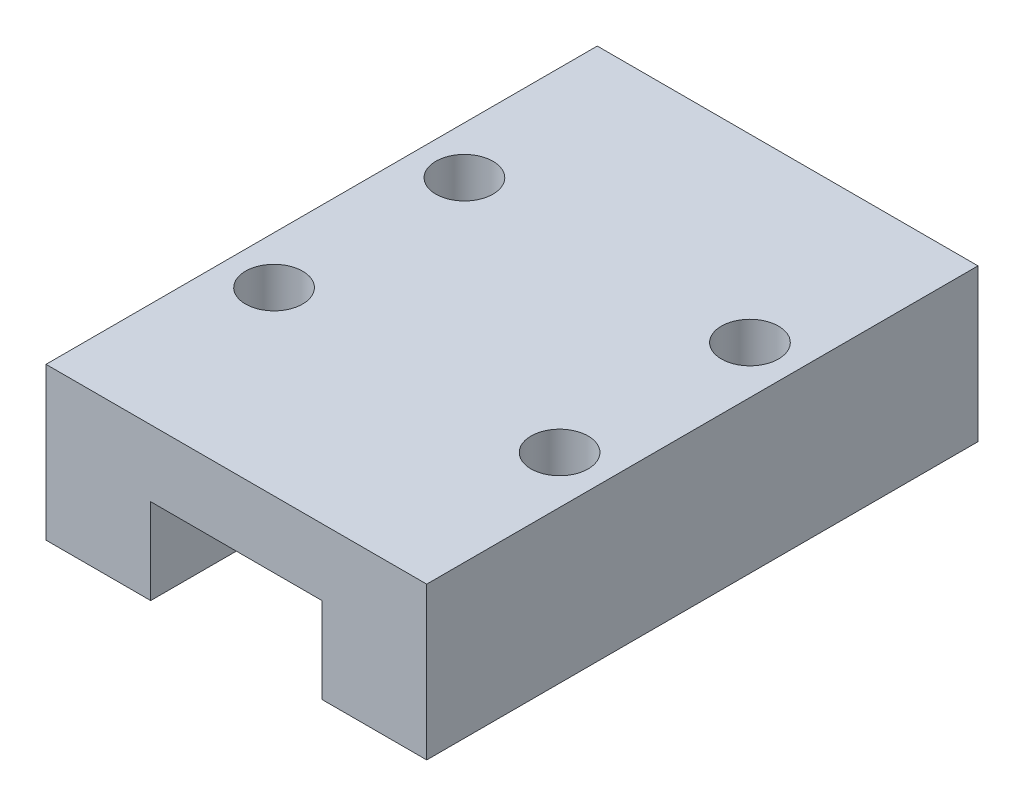
ISO-10303-21;
HEADER;
FILE_DESCRIPTION(('STEP AP214'),'2;1');
FILE_NAME('part.step','',(''),(''),'','','');
FILE_SCHEMA(('AUTOMOTIVE_DESIGN { 1 0 10303 214 1 1 1 1 }'));
ENDSEC;
DATA;
#1=APPLICATION_CONTEXT('core data for automotive mechanical design processes');
#2=APPLICATION_PROTOCOL_DEFINITION('international standard','automotive_design',2000,#1);
#3=PRODUCT_CONTEXT('',#1,'mechanical');
#4=PRODUCT('Part','Part','',(#3));
#5=PRODUCT_RELATED_PRODUCT_CATEGORY('part','',(#4));
#6=PRODUCT_DEFINITION_FORMATION('','',#4);
#7=PRODUCT_DEFINITION_CONTEXT('part definition',#1,'design');
#8=PRODUCT_DEFINITION('design','',#6,#7);
#9=PRODUCT_DEFINITION_SHAPE('','',#8);
#10=(LENGTH_UNIT() NAMED_UNIT(*) SI_UNIT(.MILLI.,.METRE.));
#11=(NAMED_UNIT(*) PLANE_ANGLE_UNIT() SI_UNIT($,.RADIAN.));
#12=(NAMED_UNIT(*) SI_UNIT($,.STERADIAN.) SOLID_ANGLE_UNIT());
#13=UNCERTAINTY_MEASURE_WITH_UNIT(LENGTH_MEASURE(1.E-05),#10,'distance_accuracy_value','');
#14=(GEOMETRIC_REPRESENTATION_CONTEXT(3) GLOBAL_UNCERTAINTY_ASSIGNED_CONTEXT((#13)) GLOBAL_UNIT_ASSIGNED_CONTEXT((#10,
#11,#12)) REPRESENTATION_CONTEXT('',''));
#15=CARTESIAN_POINT('',(0.,0.,0.));
#16=DIRECTION('',(0.,0.,1.));
#17=DIRECTION('',(1.,0.,0.));
#18=AXIS2_PLACEMENT_3D('',#15,#16,#17);
#19=CARTESIAN_POINT('',(0.,0.,28.96));
#20=DIRECTION('',(1.,0.,0.));
#21=DIRECTION('',(0.,0.,-1.));
#22=AXIS2_PLACEMENT_3D('',#19,#20,#21);
#23=PLANE('',#22);
#24=DIRECTION('',(0.,-1.,0.));
#25=VECTOR('',#24,1.);
#26=CARTESIAN_POINT('',(0.,0.,0.));
#27=LINE('',#26,#25);
#28=CARTESIAN_POINT('',(0.,8.,0.));
#29=VERTEX_POINT('',#28);
#30=CARTESIAN_POINT('',(0.,0.,0.));
#31=VERTEX_POINT('',#30);
#32=EDGE_CURVE('E129',#29,#31,#27,.T.);
#33=ORIENTED_EDGE('',*,*,#32,.T.);
#34=DIRECTION('',(0.,0.,-1.));
#35=VECTOR('',#34,1.);
#36=CARTESIAN_POINT('',(0.,0.,28.96));
#37=LINE('',#36,#35);
#38=CARTESIAN_POINT('',(0.,0.,28.96));
#39=VERTEX_POINT('',#38);
#40=EDGE_CURVE('E11',#39,#31,#37,.T.);
#41=ORIENTED_EDGE('',*,*,#40,.F.);
#42=DIRECTION('',(0.,-1.,0.));
#43=VECTOR('',#42,1.);
#44=CARTESIAN_POINT('',(0.,0.,28.96));
#45=LINE('',#44,#43);
#46=CARTESIAN_POINT('',(0.,8.,28.96));
#47=VERTEX_POINT('',#46);
#48=EDGE_CURVE('E144',#47,#39,#45,.T.);
#49=ORIENTED_EDGE('',*,*,#48,.F.);
#50=DIRECTION('',(0.,0.,-1.));
#51=VECTOR('',#50,1.);
#52=CARTESIAN_POINT('',(0.,8.,28.96));
#53=LINE('',#52,#51);
#54=EDGE_CURVE('E125',#47,#29,#53,.T.);
#55=ORIENTED_EDGE('',*,*,#54,.T.);
#56=EDGE_LOOP('',(#33,#41,#49,#55));
#57=FACE_BOUND('',#56,.T.);
#58=ADVANCED_FACE('F33',(#57),#23,.F.);
#59=CARTESIAN_POINT('',(0.,0.,28.96));
#60=DIRECTION('',(0.,1.,0.));
#61=DIRECTION('',(-1.,0.,0.));
#62=AXIS2_PLACEMENT_3D('',#59,#60,#61);
#63=PLANE('',#62);
#64=CARTESIAN_POINT('',(2.5,0.,9.48));
#65=DIRECTION('',(0.,1.,0.));
#66=DIRECTION('',(-1.,0.,0.));
#67=AXIS2_PLACEMENT_3D('',#64,#65,#66);
#68=CIRCLE('',#67,1.5);
#69=CARTESIAN_POINT('',(1.,0.,9.48));
#70=VERTEX_POINT('',#69);
#71=EDGE_CURVE('E133',#70,#70,#68,.T.);
#72=ORIENTED_EDGE('',*,*,#71,.T.);
#73=EDGE_LOOP('',(#72));
#74=FACE_BOUND('',#73,.T.);
#75=CARTESIAN_POINT('',(2.5,0.,19.48));
#76=DIRECTION('',(0.,1.,0.));
#77=DIRECTION('',(-1.,0.,0.));
#78=AXIS2_PLACEMENT_3D('',#75,#76,#77);
#79=CIRCLE('',#78,1.5);
#80=CARTESIAN_POINT('',(1.,0.,19.48));
#81=VERTEX_POINT('',#80);
#82=EDGE_CURVE('E179',#81,#81,#79,.T.);
#83=ORIENTED_EDGE('',*,*,#82,.T.);
#84=EDGE_LOOP('',(#83));
#85=FACE_BOUND('',#84,.T.);
#86=DIRECTION('',(1.,0.,0.));
#87=VECTOR('',#86,1.);
#88=CARTESIAN_POINT('',(0.,0.,0.));
#89=LINE('',#88,#87);
#90=CARTESIAN_POINT('',(5.5,0.,0.));
#91=VERTEX_POINT('',#90);
#92=EDGE_CURVE('E132',#31,#91,#89,.T.);
#93=ORIENTED_EDGE('',*,*,#92,.T.);
#94=DIRECTION('',(0.,0.,-1.));
#95=VECTOR('',#94,1.);
#96=CARTESIAN_POINT('',(5.5,0.,28.96));
#97=LINE('',#96,#95);
#98=CARTESIAN_POINT('',(5.5,0.,28.96));
#99=VERTEX_POINT('',#98);
#100=EDGE_CURVE('E41',#99,#91,#97,.T.);
#101=ORIENTED_EDGE('',*,*,#100,.F.);
#102=DIRECTION('',(1.,0.,0.));
#103=VECTOR('',#102,1.);
#104=CARTESIAN_POINT('',(0.,0.,28.96));
#105=LINE('',#104,#103);
#106=EDGE_CURVE('E92',#39,#99,#105,.T.);
#107=ORIENTED_EDGE('',*,*,#106,.F.);
#108=ORIENTED_EDGE('',*,*,#40,.T.);
#109=EDGE_LOOP('',(#93,#101,#107,#108));
#110=FACE_BOUND('',#109,.T.);
#111=ADVANCED_FACE('F227',(#74,#85,#110),#63,.F.);
#112=CARTESIAN_POINT('',(5.5,0.,28.96));
#113=DIRECTION('',(-1.,0.,0.));
#114=DIRECTION('',(0.,-1.,0.));
#115=AXIS2_PLACEMENT_3D('',#112,#113,#114);
#116=PLANE('',#115);
#117=DIRECTION('',(0.,1.,0.));
#118=VECTOR('',#117,1.);
#119=CARTESIAN_POINT('',(5.5,0.,0.));
#120=LINE('',#119,#118);
#121=CARTESIAN_POINT('',(5.5,4.5,0.));
#122=VERTEX_POINT('',#121);
#123=EDGE_CURVE('E135',#91,#122,#120,.T.);
#124=ORIENTED_EDGE('',*,*,#123,.T.);
#125=DIRECTION('',(0.,0.,-1.));
#126=VECTOR('',#125,1.);
#127=CARTESIAN_POINT('',(5.5,4.5,28.96));
#128=LINE('',#127,#126);
#129=CARTESIAN_POINT('',(5.5,4.5,28.96));
#130=VERTEX_POINT('',#129);
#131=EDGE_CURVE('E151',#130,#122,#128,.T.);
#132=ORIENTED_EDGE('',*,*,#131,.F.);
#133=DIRECTION('',(0.,1.,0.));
#134=VECTOR('',#133,1.);
#135=CARTESIAN_POINT('',(5.5,0.,28.96));
#136=LINE('',#135,#134);
#137=EDGE_CURVE('E159',#99,#130,#136,.T.);
#138=ORIENTED_EDGE('',*,*,#137,.F.);
#139=ORIENTED_EDGE('',*,*,#100,.T.);
#140=EDGE_LOOP('',(#124,#132,#138,#139));
#141=FACE_BOUND('',#140,.T.);
#142=ADVANCED_FACE('F157',(#141),#116,.F.);
#143=CARTESIAN_POINT('',(5.5,4.5,28.96));
#144=DIRECTION('',(0.,1.,0.));
#145=DIRECTION('',(-1.,0.,0.));
#146=AXIS2_PLACEMENT_3D('',#143,#144,#145);
#147=PLANE('',#146);
#148=DIRECTION('',(1.,0.,0.));
#149=VECTOR('',#148,1.);
#150=CARTESIAN_POINT('',(5.5,4.5,0.));
#151=LINE('',#150,#149);
#152=CARTESIAN_POINT('',(14.5,4.5,0.));
#153=VERTEX_POINT('',#152);
#154=EDGE_CURVE('E137',#122,#153,#151,.T.);
#155=ORIENTED_EDGE('',*,*,#154,.T.);
#156=DIRECTION('',(0.,0.,-1.));
#157=VECTOR('',#156,1.);
#158=CARTESIAN_POINT('',(14.5,4.5,28.96));
#159=LINE('',#158,#157);
#160=CARTESIAN_POINT('',(14.5,4.5,28.96));
#161=VERTEX_POINT('',#160);
#162=EDGE_CURVE('E148',#161,#153,#159,.T.);
#163=ORIENTED_EDGE('',*,*,#162,.F.);
#164=DIRECTION('',(1.,0.,0.));
#165=VECTOR('',#164,1.);
#166=CARTESIAN_POINT('',(5.5,4.5,28.96));
#167=LINE('',#166,#165);
#168=EDGE_CURVE('E171',#130,#161,#167,.T.);
#169=ORIENTED_EDGE('',*,*,#168,.F.);
#170=ORIENTED_EDGE('',*,*,#131,.T.);
#171=EDGE_LOOP('',(#155,#163,#169,#170));
#172=FACE_BOUND('',#171,.T.);
#173=ADVANCED_FACE('F167',(#172),#147,.F.);
#174=CARTESIAN_POINT('',(14.5,4.5,28.96));
#175=DIRECTION('',(1.,0.,0.));
#176=DIRECTION('',(0.,0.,-1.));
#177=AXIS2_PLACEMENT_3D('',#174,#175,#176);
#178=PLANE('',#177);
#179=DIRECTION('',(0.,-1.,0.));
#180=VECTOR('',#179,1.);
#181=CARTESIAN_POINT('',(14.5,4.5,0.));
#182=LINE('',#181,#180);
#183=CARTESIAN_POINT('',(14.5,0.,0.));
#184=VERTEX_POINT('',#183);
#185=EDGE_CURVE('E139',#153,#184,#182,.T.);
#186=ORIENTED_EDGE('',*,*,#185,.T.);
#187=DIRECTION('',(0.,0.,-1.));
#188=VECTOR('',#187,1.);
#189=CARTESIAN_POINT('',(14.5,0.,28.96));
#190=LINE('',#189,#188);
#191=CARTESIAN_POINT('',(14.5,0.,28.96));
#192=VERTEX_POINT('',#191);
#193=EDGE_CURVE('E120',#192,#184,#190,.T.);
#194=ORIENTED_EDGE('',*,*,#193,.F.);
#195=DIRECTION('',(0.,-1.,0.));
#196=VECTOR('',#195,1.);
#197=CARTESIAN_POINT('',(14.5,4.5,28.96));
#198=LINE('',#197,#196);
#199=EDGE_CURVE('E111',#161,#192,#198,.T.);
#200=ORIENTED_EDGE('',*,*,#199,.F.);
#201=ORIENTED_EDGE('',*,*,#162,.T.);
#202=EDGE_LOOP('',(#186,#194,#200,#201));
#203=FACE_BOUND('',#202,.T.);
#204=ADVANCED_FACE('F170',(#203),#178,.F.);
#205=CARTESIAN_POINT('',(14.5,0.,28.96));
#206=DIRECTION('',(0.,1.,0.));
#207=DIRECTION('',(0.,0.,1.));
#208=AXIS2_PLACEMENT_3D('',#205,#206,#207);
#209=PLANE('',#208);
#210=CARTESIAN_POINT('',(17.5,0.,19.48));
#211=DIRECTION('',(0.,1.,0.));
#212=DIRECTION('',(0.,0.,1.));
#213=AXIS2_PLACEMENT_3D('',#210,#211,#212);
#214=CIRCLE('',#213,1.5);
#215=CARTESIAN_POINT('',(17.5,0.,20.98));
#216=VERTEX_POINT('',#215);
#217=EDGE_CURVE('E182',#216,#216,#214,.T.);
#218=ORIENTED_EDGE('',*,*,#217,.T.);
#219=EDGE_LOOP('',(#218));
#220=FACE_BOUND('',#219,.T.);
#221=CARTESIAN_POINT('',(17.5,0.,9.48));
#222=DIRECTION('',(0.,1.,0.));
#223=DIRECTION('',(0.,0.,1.));
#224=AXIS2_PLACEMENT_3D('',#221,#222,#223);
#225=CIRCLE('',#224,1.5);
#226=CARTESIAN_POINT('',(17.5,0.,10.98));
#227=VERTEX_POINT('',#226);
#228=EDGE_CURVE('E185',#227,#227,#225,.T.);
#229=ORIENTED_EDGE('',*,*,#228,.T.);
#230=EDGE_LOOP('',(#229));
#231=FACE_BOUND('',#230,.T.);
#232=DIRECTION('',(1.,0.,0.));
#233=VECTOR('',#232,1.);
#234=CARTESIAN_POINT('',(14.5,0.,0.));
#235=LINE('',#234,#233);
#236=CARTESIAN_POINT('',(20.,0.,0.));
#237=VERTEX_POINT('',#236);
#238=EDGE_CURVE('E119',#184,#237,#235,.T.);
#239=ORIENTED_EDGE('',*,*,#238,.T.);
#240=DIRECTION('',(0.,0.,-1.));
#241=VECTOR('',#240,1.);
#242=CARTESIAN_POINT('',(20.,0.,28.96));
#243=LINE('',#242,#241);
#244=CARTESIAN_POINT('',(20.,0.,28.96));
#245=VERTEX_POINT('',#244);
#246=EDGE_CURVE('E116',#245,#237,#243,.T.);
#247=ORIENTED_EDGE('',*,*,#246,.F.);
#248=DIRECTION('',(1.,0.,0.));
#249=VECTOR('',#248,1.);
#250=CARTESIAN_POINT('',(14.5,0.,28.96));
#251=LINE('',#250,#249);
#252=EDGE_CURVE('E105',#192,#245,#251,.T.);
#253=ORIENTED_EDGE('',*,*,#252,.F.);
#254=ORIENTED_EDGE('',*,*,#193,.T.);
#255=EDGE_LOOP('',(#239,#247,#253,#254));
#256=FACE_BOUND('',#255,.T.);
#257=ADVANCED_FACE('F117',(#220,#231,#256),#209,.F.);
#258=CARTESIAN_POINT('',(20.,0.,28.96));
#259=DIRECTION('',(-1.,0.,0.));
#260=DIRECTION('',(0.,0.,1.));
#261=AXIS2_PLACEMENT_3D('',#258,#259,#260);
#262=PLANE('',#261);
#263=DIRECTION('',(0.,1.,0.));
#264=VECTOR('',#263,1.);
#265=CARTESIAN_POINT('',(20.,0.,0.));
#266=LINE('',#265,#264);
#267=CARTESIAN_POINT('',(20.,8.,0.));
#268=VERTEX_POINT('',#267);
#269=EDGE_CURVE('E78',#237,#268,#266,.T.);
#270=ORIENTED_EDGE('',*,*,#269,.T.);
#271=DIRECTION('',(0.,0.,-1.));
#272=VECTOR('',#271,1.);
#273=CARTESIAN_POINT('',(20.,8.,28.96));
#274=LINE('',#273,#272);
#275=CARTESIAN_POINT('',(20.,8.,28.96));
#276=VERTEX_POINT('',#275);
#277=EDGE_CURVE('E121',#276,#268,#274,.T.);
#278=ORIENTED_EDGE('',*,*,#277,.F.);
#279=DIRECTION('',(0.,1.,0.));
#280=VECTOR('',#279,1.);
#281=CARTESIAN_POINT('',(20.,0.,28.96));
#282=LINE('',#281,#280);
#283=EDGE_CURVE('E109',#245,#276,#282,.T.);
#284=ORIENTED_EDGE('',*,*,#283,.F.);
#285=ORIENTED_EDGE('',*,*,#246,.T.);
#286=EDGE_LOOP('',(#270,#278,#284,#285));
#287=FACE_BOUND('',#286,.T.);
#288=ADVANCED_FACE('F123',(#287),#262,.F.);
#289=CARTESIAN_POINT('',(0.,8.,28.96));
#290=DIRECTION('',(0.,-1.,0.));
#291=DIRECTION('',(0.,0.,-1.));
#292=AXIS2_PLACEMENT_3D('',#289,#290,#291);
#293=PLANE('',#292);
#294=CARTESIAN_POINT('',(2.5,8.,9.48));
#295=DIRECTION('',(0.,1.,0.));
#296=DIRECTION('',(0.,0.,1.));
#297=AXIS2_PLACEMENT_3D('',#294,#295,#296);
#298=CIRCLE('',#297,1.5);
#299=CARTESIAN_POINT('',(2.5,8.,10.98));
#300=VERTEX_POINT('',#299);
#301=EDGE_CURVE('E192',#300,#300,#298,.T.);
#302=ORIENTED_EDGE('',*,*,#301,.F.);
#303=EDGE_LOOP('',(#302));
#304=FACE_BOUND('',#303,.T.);
#305=CARTESIAN_POINT('',(2.5,8.,19.48));
#306=DIRECTION('',(0.,1.,0.));
#307=DIRECTION('',(0.,0.,1.));
#308=AXIS2_PLACEMENT_3D('',#305,#306,#307);
#309=CIRCLE('',#308,1.5);
#310=CARTESIAN_POINT('',(2.5,8.,20.98));
#311=VERTEX_POINT('',#310);
#312=EDGE_CURVE('E195',#311,#311,#309,.T.);
#313=ORIENTED_EDGE('',*,*,#312,.F.);
#314=EDGE_LOOP('',(#313));
#315=FACE_BOUND('',#314,.T.);
#316=CARTESIAN_POINT('',(17.5,8.,19.48));
#317=DIRECTION('',(0.,1.,0.));
#318=DIRECTION('',(0.,0.,1.));
#319=AXIS2_PLACEMENT_3D('',#316,#317,#318);
#320=CIRCLE('',#319,1.5);
#321=CARTESIAN_POINT('',(17.5,8.,20.98));
#322=VERTEX_POINT('',#321);
#323=EDGE_CURVE('E191',#322,#322,#320,.T.);
#324=ORIENTED_EDGE('',*,*,#323,.F.);
#325=EDGE_LOOP('',(#324));
#326=FACE_BOUND('',#325,.T.);
#327=CARTESIAN_POINT('',(17.5,8.,9.48));
#328=DIRECTION('',(0.,1.,0.));
#329=DIRECTION('',(0.,0.,1.));
#330=AXIS2_PLACEMENT_3D('',#327,#328,#329);
#331=CIRCLE('',#330,1.5);
#332=CARTESIAN_POINT('',(17.5,8.,10.98));
#333=VERTEX_POINT('',#332);
#334=EDGE_CURVE('E188',#333,#333,#331,.T.);
#335=ORIENTED_EDGE('',*,*,#334,.F.);
#336=EDGE_LOOP('',(#335));
#337=FACE_BOUND('',#336,.T.);
#338=DIRECTION('',(-1.,0.,0.));
#339=VECTOR('',#338,1.);
#340=CARTESIAN_POINT('',(0.,8.,0.));
#341=LINE('',#340,#339);
#342=EDGE_CURVE('E84',#268,#29,#341,.T.);
#343=ORIENTED_EDGE('',*,*,#342,.T.);
#344=ORIENTED_EDGE('',*,*,#54,.F.);
#345=DIRECTION('',(-1.,0.,0.));
#346=VECTOR('',#345,1.);
#347=CARTESIAN_POINT('',(0.,8.,28.96));
#348=LINE('',#347,#346);
#349=EDGE_CURVE('E49',#276,#47,#348,.T.);
#350=ORIENTED_EDGE('',*,*,#349,.F.);
#351=ORIENTED_EDGE('',*,*,#277,.T.);
#352=EDGE_LOOP('',(#343,#344,#350,#351));
#353=FACE_BOUND('',#352,.T.);
#354=ADVANCED_FACE('F204',(#304,#315,#326,#337,#353),#293,.F.);
#355=CARTESIAN_POINT('',(0.,0.,28.96));
#356=DIRECTION('',(0.,0.,-1.));
#357=DIRECTION('',(-1.,0.,0.));
#358=AXIS2_PLACEMENT_3D('',#355,#356,#357);
#359=PLANE('',#358);
#360=ORIENTED_EDGE('',*,*,#48,.T.);
#361=ORIENTED_EDGE('',*,*,#106,.T.);
#362=ORIENTED_EDGE('',*,*,#137,.T.);
#363=ORIENTED_EDGE('',*,*,#168,.T.);
#364=ORIENTED_EDGE('',*,*,#199,.T.);
#365=ORIENTED_EDGE('',*,*,#252,.T.);
#366=ORIENTED_EDGE('',*,*,#283,.T.);
#367=ORIENTED_EDGE('',*,*,#349,.T.);
#368=EDGE_LOOP('',(#360,#361,#362,#363,#364,#365,#366,#367));
#369=FACE_BOUND('',#368,.T.);
#370=ADVANCED_FACE('F107',(#369),#359,.F.);
#371=CARTESIAN_POINT('',(0.,0.,0.));
#372=DIRECTION('',(0.,0.,-1.));
#373=DIRECTION('',(-1.,0.,0.));
#374=AXIS2_PLACEMENT_3D('',#371,#372,#373);
#375=PLANE('',#374);
#376=ORIENTED_EDGE('',*,*,#32,.F.);
#377=ORIENTED_EDGE('',*,*,#342,.F.);
#378=ORIENTED_EDGE('',*,*,#269,.F.);
#379=ORIENTED_EDGE('',*,*,#238,.F.);
#380=ORIENTED_EDGE('',*,*,#185,.F.);
#381=ORIENTED_EDGE('',*,*,#154,.F.);
#382=ORIENTED_EDGE('',*,*,#123,.F.);
#383=ORIENTED_EDGE('',*,*,#92,.F.);
#384=EDGE_LOOP('',(#376,#377,#378,#379,#380,#381,#382,#383));
#385=FACE_BOUND('',#384,.T.);
#386=ADVANCED_FACE('F163',(#385),#375,.T.);
#387=CARTESIAN_POINT('',(17.5,-20.96,9.48));
#388=DIRECTION('',(0.,1.,0.));
#389=DIRECTION('',(0.,0.,1.));
#390=AXIS2_PLACEMENT_3D('',#387,#388,#389);
#391=CYLINDRICAL_SURFACE('',#390,1.5);
#392=ORIENTED_EDGE('',*,*,#334,.T.);
#393=EDGE_LOOP('',(#392));
#394=FACE_BOUND('',#393,.T.);
#395=ORIENTED_EDGE('',*,*,#228,.F.);
#396=EDGE_LOOP('',(#395));
#397=FACE_BOUND('',#396,.T.);
#398=ADVANCED_FACE('F211',(#394,#397),#391,.F.);
#399=CARTESIAN_POINT('',(17.5,-20.96,19.48));
#400=DIRECTION('',(0.,1.,0.));
#401=DIRECTION('',(0.,0.,1.));
#402=AXIS2_PLACEMENT_3D('',#399,#400,#401);
#403=CYLINDRICAL_SURFACE('',#402,1.5);
#404=ORIENTED_EDGE('',*,*,#323,.T.);
#405=EDGE_LOOP('',(#404));
#406=FACE_BOUND('',#405,.T.);
#407=ORIENTED_EDGE('',*,*,#217,.F.);
#408=EDGE_LOOP('',(#407));
#409=FACE_BOUND('',#408,.T.);
#410=ADVANCED_FACE('F201',(#406,#409),#403,.F.);
#411=CARTESIAN_POINT('',(2.5,-20.96,19.48));
#412=DIRECTION('',(0.,1.,0.));
#413=DIRECTION('',(0.,0.,1.));
#414=AXIS2_PLACEMENT_3D('',#411,#412,#413);
#415=CYLINDRICAL_SURFACE('',#414,1.5);
#416=ORIENTED_EDGE('',*,*,#312,.T.);
#417=EDGE_LOOP('',(#416));
#418=FACE_BOUND('',#417,.T.);
#419=ORIENTED_EDGE('',*,*,#82,.F.);
#420=EDGE_LOOP('',(#419));
#421=FACE_BOUND('',#420,.T.);
#422=ADVANCED_FACE('F303',(#418,#421),#415,.F.);
#423=CARTESIAN_POINT('',(2.5,-20.96,9.48));
#424=DIRECTION('',(0.,1.,0.));
#425=DIRECTION('',(0.,0.,1.));
#426=AXIS2_PLACEMENT_3D('',#423,#424,#425);
#427=CYLINDRICAL_SURFACE('',#426,1.5);
#428=ORIENTED_EDGE('',*,*,#301,.T.);
#429=EDGE_LOOP('',(#428));
#430=FACE_BOUND('',#429,.T.);
#431=ORIENTED_EDGE('',*,*,#71,.F.);
#432=EDGE_LOOP('',(#431));
#433=FACE_BOUND('',#432,.T.);
#434=ADVANCED_FACE('F312',(#430,#433),#427,.F.);
#435=CLOSED_SHELL('',(#58,#111,#142,#173,#204,#257,#288,#354,#370,#386,#398,#410,#422,#434));
#436=MANIFOLD_SOLID_BREP('B2',#435);
#437=ADVANCED_BREP_SHAPE_REPRESENTATION('',(#18,#436),#14);
#438=SHAPE_DEFINITION_REPRESENTATION(#9,#437);
ENDSEC;
END-ISO-10303-21;
